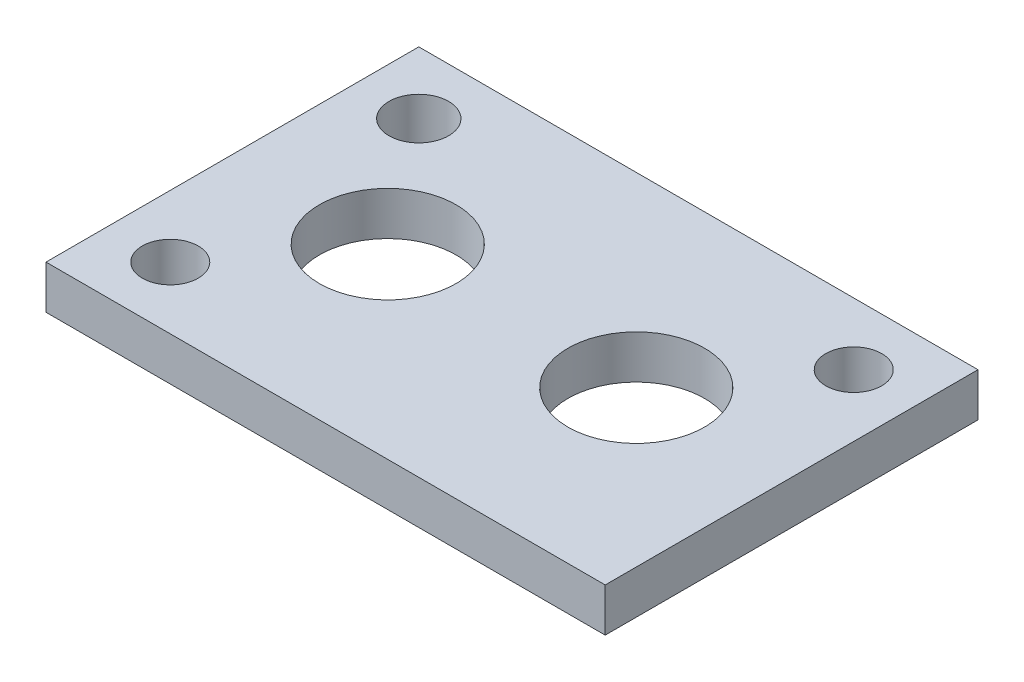
ISO-10303-21;
HEADER;
FILE_DESCRIPTION(('STEP AP214'),'2;1');
FILE_NAME('part.step','',(''),(''),'','','');
FILE_SCHEMA(('AUTOMOTIVE_DESIGN { 1 0 10303 214 1 1 1 1 }'));
ENDSEC;
DATA;
#1=APPLICATION_CONTEXT('core data for automotive mechanical design processes');
#2=APPLICATION_PROTOCOL_DEFINITION('international standard','automotive_design',2000,#1);
#3=PRODUCT_CONTEXT('',#1,'mechanical');
#4=PRODUCT('Part','Part','',(#3));
#5=PRODUCT_RELATED_PRODUCT_CATEGORY('part','',(#4));
#6=PRODUCT_DEFINITION_FORMATION('','',#4);
#7=PRODUCT_DEFINITION_CONTEXT('part definition',#1,'design');
#8=PRODUCT_DEFINITION('design','',#6,#7);
#9=PRODUCT_DEFINITION_SHAPE('','',#8);
#10=(LENGTH_UNIT() NAMED_UNIT(*) SI_UNIT(.MILLI.,.METRE.));
#11=(NAMED_UNIT(*) PLANE_ANGLE_UNIT() SI_UNIT($,.RADIAN.));
#12=(NAMED_UNIT(*) SI_UNIT($,.STERADIAN.) SOLID_ANGLE_UNIT());
#13=UNCERTAINTY_MEASURE_WITH_UNIT(LENGTH_MEASURE(1.E-05),#10,'distance_accuracy_value','');
#14=(GEOMETRIC_REPRESENTATION_CONTEXT(3) GLOBAL_UNCERTAINTY_ASSIGNED_CONTEXT((#13)) GLOBAL_UNIT_ASSIGNED_CONTEXT((#10,
#11,#12)) REPRESENTATION_CONTEXT('',''));
#15=CARTESIAN_POINT('',(0.,0.,0.));
#16=DIRECTION('',(0.,0.,1.));
#17=DIRECTION('',(1.,0.,0.));
#18=AXIS2_PLACEMENT_3D('',#15,#16,#17);
#19=CARTESIAN_POINT('',(0.,7.,0.));
#20=DIRECTION('',(1.,0.,0.));
#21=DIRECTION('',(0.,0.,-1.));
#22=AXIS2_PLACEMENT_3D('',#19,#20,#21);
#23=PLANE('',#22);
#24=DIRECTION('',(0.,0.,1.));
#25=VECTOR('',#24,1.);
#26=CARTESIAN_POINT('',(0.,0.,0.));
#27=LINE('',#26,#25);
#28=CARTESIAN_POINT('',(0.,0.,-60.));
#29=VERTEX_POINT('',#28);
#30=CARTESIAN_POINT('',(0.,0.,0.));
#31=VERTEX_POINT('',#30);
#32=EDGE_CURVE('E96',#29,#31,#27,.T.);
#33=ORIENTED_EDGE('',*,*,#32,.T.);
#34=DIRECTION('',(0.,-1.,0.));
#35=VECTOR('',#34,1.);
#36=CARTESIAN_POINT('',(0.,7.,0.));
#37=LINE('',#36,#35);
#38=CARTESIAN_POINT('',(0.,7.,0.));
#39=VERTEX_POINT('',#38);
#40=EDGE_CURVE('E11',#39,#31,#37,.T.);
#41=ORIENTED_EDGE('',*,*,#40,.F.);
#42=DIRECTION('',(0.,0.,1.));
#43=VECTOR('',#42,1.);
#44=CARTESIAN_POINT('',(0.,7.,0.));
#45=LINE('',#44,#43);
#46=CARTESIAN_POINT('',(0.,7.,-60.));
#47=VERTEX_POINT('',#46);
#48=EDGE_CURVE('E84',#47,#39,#45,.T.);
#49=ORIENTED_EDGE('',*,*,#48,.F.);
#50=DIRECTION('',(0.,-1.,0.));
#51=VECTOR('',#50,1.);
#52=CARTESIAN_POINT('',(0.,7.,-60.));
#53=LINE('',#52,#51);
#54=EDGE_CURVE('E92',#47,#29,#53,.T.);
#55=ORIENTED_EDGE('',*,*,#54,.T.);
#56=EDGE_LOOP('',(#33,#41,#49,#55));
#57=FACE_BOUND('',#56,.T.);
#58=ADVANCED_FACE('F33',(#57),#23,.F.);
#59=CARTESIAN_POINT('',(0.,7.,0.));
#60=DIRECTION('',(0.,0.,-1.));
#61=DIRECTION('',(-1.,0.,0.));
#62=AXIS2_PLACEMENT_3D('',#59,#60,#61);
#63=PLANE('',#62);
#64=DIRECTION('',(1.,0.,0.));
#65=VECTOR('',#64,1.);
#66=CARTESIAN_POINT('',(0.,0.,0.));
#67=LINE('',#66,#65);
#68=CARTESIAN_POINT('',(90.,0.,0.));
#69=VERTEX_POINT('',#68);
#70=EDGE_CURVE('E88',#31,#69,#67,.T.);
#71=ORIENTED_EDGE('',*,*,#70,.T.);
#72=DIRECTION('',(0.,-1.,0.));
#73=VECTOR('',#72,1.);
#74=CARTESIAN_POINT('',(90.,7.,0.));
#75=LINE('',#74,#73);
#76=CARTESIAN_POINT('',(90.,7.,0.));
#77=VERTEX_POINT('',#76);
#78=EDGE_CURVE('E41',#77,#69,#75,.T.);
#79=ORIENTED_EDGE('',*,*,#78,.F.);
#80=DIRECTION('',(1.,0.,0.));
#81=VECTOR('',#80,1.);
#82=CARTESIAN_POINT('',(0.,7.,0.));
#83=LINE('',#82,#81);
#84=EDGE_CURVE('E79',#39,#77,#83,.T.);
#85=ORIENTED_EDGE('',*,*,#84,.F.);
#86=ORIENTED_EDGE('',*,*,#40,.T.);
#87=EDGE_LOOP('',(#71,#79,#85,#86));
#88=FACE_BOUND('',#87,.T.);
#89=ADVANCED_FACE('F87',(#88),#63,.F.);
#90=CARTESIAN_POINT('',(90.,7.,0.));
#91=DIRECTION('',(-1.,0.,0.));
#92=DIRECTION('',(0.,0.,1.));
#93=AXIS2_PLACEMENT_3D('',#90,#91,#92);
#94=PLANE('',#93);
#95=DIRECTION('',(0.,0.,-1.));
#96=VECTOR('',#95,1.);
#97=CARTESIAN_POINT('',(90.,0.,0.));
#98=LINE('',#97,#96);
#99=CARTESIAN_POINT('',(90.,0.,-60.));
#100=VERTEX_POINT('',#99);
#101=EDGE_CURVE('E66',#69,#100,#98,.T.);
#102=ORIENTED_EDGE('',*,*,#101,.T.);
#103=DIRECTION('',(0.,-1.,0.));
#104=VECTOR('',#103,1.);
#105=CARTESIAN_POINT('',(90.,7.,-60.));
#106=LINE('',#105,#104);
#107=CARTESIAN_POINT('',(90.,7.,-60.));
#108=VERTEX_POINT('',#107);
#109=EDGE_CURVE('E89',#108,#100,#106,.T.);
#110=ORIENTED_EDGE('',*,*,#109,.F.);
#111=DIRECTION('',(0.,0.,-1.));
#112=VECTOR('',#111,1.);
#113=CARTESIAN_POINT('',(90.,7.,0.));
#114=LINE('',#113,#112);
#115=EDGE_CURVE('E82',#77,#108,#114,.T.);
#116=ORIENTED_EDGE('',*,*,#115,.F.);
#117=ORIENTED_EDGE('',*,*,#78,.T.);
#118=EDGE_LOOP('',(#102,#110,#116,#117));
#119=FACE_BOUND('',#118,.T.);
#120=ADVANCED_FACE('F90',(#119),#94,.F.);
#121=CARTESIAN_POINT('',(0.,7.,-60.));
#122=DIRECTION('',(0.,0.,1.));
#123=DIRECTION('',(1.,0.,0.));
#124=AXIS2_PLACEMENT_3D('',#121,#122,#123);
#125=PLANE('',#124);
#126=DIRECTION('',(-1.,0.,0.));
#127=VECTOR('',#126,1.);
#128=CARTESIAN_POINT('',(0.,0.,-60.));
#129=LINE('',#128,#127);
#130=EDGE_CURVE('E72',#100,#29,#129,.T.);
#131=ORIENTED_EDGE('',*,*,#130,.T.);
#132=ORIENTED_EDGE('',*,*,#54,.F.);
#133=DIRECTION('',(-1.,0.,0.));
#134=VECTOR('',#133,1.);
#135=CARTESIAN_POINT('',(0.,7.,-60.));
#136=LINE('',#135,#134);
#137=EDGE_CURVE('E49',#108,#47,#136,.T.);
#138=ORIENTED_EDGE('',*,*,#137,.F.);
#139=ORIENTED_EDGE('',*,*,#109,.T.);
#140=EDGE_LOOP('',(#131,#132,#138,#139));
#141=FACE_BOUND('',#140,.T.);
#142=ADVANCED_FACE('F104',(#141),#125,.F.);
#143=CARTESIAN_POINT('',(0.,7.,0.));
#144=DIRECTION('',(0.,-1.,0.));
#145=DIRECTION('',(0.,0.,-1.));
#146=AXIS2_PLACEMENT_3D('',#143,#144,#145);
#147=PLANE('',#146);
#148=CARTESIAN_POINT('',(10.,7.,-50.));
#149=DIRECTION('',(0.,1.,0.));
#150=DIRECTION('',(0.,0.,1.));
#151=AXIS2_PLACEMENT_3D('',#148,#149,#150);
#152=CIRCLE('',#151,4.8);
#153=CARTESIAN_POINT('',(10.,7.,-45.2));
#154=VERTEX_POINT('',#153);
#155=EDGE_CURVE('E134',#154,#154,#152,.T.);
#156=ORIENTED_EDGE('',*,*,#155,.F.);
#157=EDGE_LOOP('',(#156));
#158=FACE_BOUND('',#157,.T.);
#159=CARTESIAN_POINT('',(80.,7.,-50.));
#160=DIRECTION('',(0.,1.,0.));
#161=DIRECTION('',(0.,0.,1.));
#162=AXIS2_PLACEMENT_3D('',#159,#160,#161);
#163=CIRCLE('',#162,4.5);
#164=CARTESIAN_POINT('',(80.,7.,-45.5));
#165=VERTEX_POINT('',#164);
#166=EDGE_CURVE('E130',#165,#165,#163,.T.);
#167=ORIENTED_EDGE('',*,*,#166,.F.);
#168=EDGE_LOOP('',(#167));
#169=FACE_BOUND('',#168,.T.);
#170=CARTESIAN_POINT('',(9.99999999999999,7.,-10.));
#171=DIRECTION('',(0.,1.,0.));
#172=DIRECTION('',(0.,0.,1.));
#173=AXIS2_PLACEMENT_3D('',#170,#171,#172);
#174=CIRCLE('',#173,4.5);
#175=CARTESIAN_POINT('',(9.99999999999999,7.,-5.5));
#176=VERTEX_POINT('',#175);
#177=EDGE_CURVE('E124',#176,#176,#174,.T.);
#178=ORIENTED_EDGE('',*,*,#177,.F.);
#179=EDGE_LOOP('',(#178));
#180=FACE_BOUND('',#179,.T.);
#181=CARTESIAN_POINT('',(25.,7.,-30.));
#182=DIRECTION('',(0.,1.,0.));
#183=DIRECTION('',(0.,0.,1.));
#184=AXIS2_PLACEMENT_3D('',#181,#182,#183);
#185=CIRCLE('',#184,11.);
#186=CARTESIAN_POINT('',(25.,7.,-19.));
#187=VERTEX_POINT('',#186);
#188=EDGE_CURVE('E118',#187,#187,#185,.T.);
#189=ORIENTED_EDGE('',*,*,#188,.F.);
#190=EDGE_LOOP('',(#189));
#191=FACE_BOUND('',#190,.T.);
#192=CARTESIAN_POINT('',(65.,7.,-30.));
#193=DIRECTION('',(0.,1.,0.));
#194=DIRECTION('',(0.,0.,1.));
#195=AXIS2_PLACEMENT_3D('',#192,#193,#194);
#196=CIRCLE('',#195,11.);
#197=CARTESIAN_POINT('',(65.,7.,-19.));
#198=VERTEX_POINT('',#197);
#199=EDGE_CURVE('E112',#198,#198,#196,.T.);
#200=ORIENTED_EDGE('',*,*,#199,.F.);
#201=EDGE_LOOP('',(#200));
#202=FACE_BOUND('',#201,.T.);
#203=ORIENTED_EDGE('',*,*,#48,.T.);
#204=ORIENTED_EDGE('',*,*,#84,.T.);
#205=ORIENTED_EDGE('',*,*,#115,.T.);
#206=ORIENTED_EDGE('',*,*,#137,.T.);
#207=EDGE_LOOP('',(#203,#204,#205,#206));
#208=FACE_BOUND('',#207,.T.);
#209=ADVANCED_FACE('F80',(#158,#169,#180,#191,#202,#208),#147,.F.);
#210=CARTESIAN_POINT('',(0.,0.,0.));
#211=DIRECTION('',(0.,-1.,0.));
#212=DIRECTION('',(0.,0.,-1.));
#213=AXIS2_PLACEMENT_3D('',#210,#211,#212);
#214=PLANE('',#213);
#215=CARTESIAN_POINT('',(10.,0.,-50.));
#216=DIRECTION('',(0.,1.,0.));
#217=DIRECTION('',(0.,0.,1.));
#218=AXIS2_PLACEMENT_3D('',#215,#216,#217);
#219=CIRCLE('',#218,4.8);
#220=CARTESIAN_POINT('',(10.,0.,-45.2));
#221=VERTEX_POINT('',#220);
#222=EDGE_CURVE('E133',#221,#221,#219,.T.);
#223=ORIENTED_EDGE('',*,*,#222,.T.);
#224=EDGE_LOOP('',(#223));
#225=FACE_BOUND('',#224,.T.);
#226=CARTESIAN_POINT('',(80.,0.,-50.));
#227=DIRECTION('',(0.,1.,0.));
#228=DIRECTION('',(0.,0.,1.));
#229=AXIS2_PLACEMENT_3D('',#226,#227,#228);
#230=CIRCLE('',#229,4.5);
#231=CARTESIAN_POINT('',(80.,0.,-45.5));
#232=VERTEX_POINT('',#231);
#233=EDGE_CURVE('E127',#232,#232,#230,.T.);
#234=ORIENTED_EDGE('',*,*,#233,.T.);
#235=EDGE_LOOP('',(#234));
#236=FACE_BOUND('',#235,.T.);
#237=CARTESIAN_POINT('',(9.99999999999999,0.,-10.));
#238=DIRECTION('',(0.,1.,0.));
#239=DIRECTION('',(0.,0.,1.));
#240=AXIS2_PLACEMENT_3D('',#237,#238,#239);
#241=CIRCLE('',#240,4.5);
#242=CARTESIAN_POINT('',(9.99999999999999,0.,-5.5));
#243=VERTEX_POINT('',#242);
#244=EDGE_CURVE('E121',#243,#243,#241,.T.);
#245=ORIENTED_EDGE('',*,*,#244,.T.);
#246=EDGE_LOOP('',(#245));
#247=FACE_BOUND('',#246,.T.);
#248=CARTESIAN_POINT('',(25.,0.,-30.));
#249=DIRECTION('',(0.,1.,0.));
#250=DIRECTION('',(0.,0.,1.));
#251=AXIS2_PLACEMENT_3D('',#248,#249,#250);
#252=CIRCLE('',#251,11.);
#253=CARTESIAN_POINT('',(25.,0.,-19.));
#254=VERTEX_POINT('',#253);
#255=EDGE_CURVE('E115',#254,#254,#252,.T.);
#256=ORIENTED_EDGE('',*,*,#255,.T.);
#257=EDGE_LOOP('',(#256));
#258=FACE_BOUND('',#257,.T.);
#259=CARTESIAN_POINT('',(65.,0.,-30.));
#260=DIRECTION('',(0.,1.,0.));
#261=DIRECTION('',(0.,0.,1.));
#262=AXIS2_PLACEMENT_3D('',#259,#260,#261);
#263=CIRCLE('',#262,11.);
#264=CARTESIAN_POINT('',(65.,0.,-19.));
#265=VERTEX_POINT('',#264);
#266=EDGE_CURVE('E99',#265,#265,#263,.T.);
#267=ORIENTED_EDGE('',*,*,#266,.T.);
#268=EDGE_LOOP('',(#267));
#269=FACE_BOUND('',#268,.T.);
#270=ORIENTED_EDGE('',*,*,#32,.F.);
#271=ORIENTED_EDGE('',*,*,#130,.F.);
#272=ORIENTED_EDGE('',*,*,#101,.F.);
#273=ORIENTED_EDGE('',*,*,#70,.F.);
#274=EDGE_LOOP('',(#270,#271,#272,#273));
#275=FACE_BOUND('',#274,.T.);
#276=ADVANCED_FACE('F107',(#225,#236,#247,#258,#269,#275),#214,.T.);
#277=CARTESIAN_POINT('',(65.,7.,-30.));
#278=DIRECTION('',(0.,1.,0.));
#279=DIRECTION('',(0.,0.,1.));
#280=AXIS2_PLACEMENT_3D('',#277,#278,#279);
#281=CYLINDRICAL_SURFACE('',#280,11.);
#282=ORIENTED_EDGE('',*,*,#266,.F.);
#283=EDGE_LOOP('',(#282));
#284=FACE_BOUND('',#283,.T.);
#285=ORIENTED_EDGE('',*,*,#199,.T.);
#286=EDGE_LOOP('',(#285));
#287=FACE_BOUND('',#286,.T.);
#288=ADVANCED_FACE('F160',(#284,#287),#281,.F.);
#289=CARTESIAN_POINT('',(25.,7.,-30.));
#290=DIRECTION('',(0.,1.,0.));
#291=DIRECTION('',(0.,0.,1.));
#292=AXIS2_PLACEMENT_3D('',#289,#290,#291);
#293=CYLINDRICAL_SURFACE('',#292,11.);
#294=ORIENTED_EDGE('',*,*,#255,.F.);
#295=EDGE_LOOP('',(#294));
#296=FACE_BOUND('',#295,.T.);
#297=ORIENTED_EDGE('',*,*,#188,.T.);
#298=EDGE_LOOP('',(#297));
#299=FACE_BOUND('',#298,.T.);
#300=ADVANCED_FACE('F162',(#296,#299),#293,.F.);
#301=CARTESIAN_POINT('',(9.99999999999999,7.,-10.));
#302=DIRECTION('',(0.,1.,0.));
#303=DIRECTION('',(0.,0.,1.));
#304=AXIS2_PLACEMENT_3D('',#301,#302,#303);
#305=CYLINDRICAL_SURFACE('',#304,4.5);
#306=ORIENTED_EDGE('',*,*,#244,.F.);
#307=EDGE_LOOP('',(#306));
#308=FACE_BOUND('',#307,.T.);
#309=ORIENTED_EDGE('',*,*,#177,.T.);
#310=EDGE_LOOP('',(#309));
#311=FACE_BOUND('',#310,.T.);
#312=ADVANCED_FACE('F169',(#308,#311),#305,.F.);
#313=CARTESIAN_POINT('',(80.,7.,-50.));
#314=DIRECTION('',(0.,1.,0.));
#315=DIRECTION('',(0.,0.,1.));
#316=AXIS2_PLACEMENT_3D('',#313,#314,#315);
#317=CYLINDRICAL_SURFACE('',#316,4.5);
#318=ORIENTED_EDGE('',*,*,#233,.F.);
#319=EDGE_LOOP('',(#318));
#320=FACE_BOUND('',#319,.T.);
#321=ORIENTED_EDGE('',*,*,#166,.T.);
#322=EDGE_LOOP('',(#321));
#323=FACE_BOUND('',#322,.T.);
#324=ADVANCED_FACE('F145',(#320,#323),#317,.F.);
#325=CARTESIAN_POINT('',(10.,0.,-50.));
#326=DIRECTION('',(0.,1.,0.));
#327=DIRECTION('',(0.,0.,1.));
#328=AXIS2_PLACEMENT_3D('',#325,#326,#327);
#329=CYLINDRICAL_SURFACE('',#328,4.8);
#330=ORIENTED_EDGE('',*,*,#222,.F.);
#331=EDGE_LOOP('',(#330));
#332=FACE_BOUND('',#331,.T.);
#333=ORIENTED_EDGE('',*,*,#155,.T.);
#334=EDGE_LOOP('',(#333));
#335=FACE_BOUND('',#334,.T.);
#336=ADVANCED_FACE('F142',(#332,#335),#329,.F.);
#337=CLOSED_SHELL('',(#58,#89,#120,#142,#209,#276,#288,#300,#312,#324,#336));
#338=MANIFOLD_SOLID_BREP('B2',#337);
#339=ADVANCED_BREP_SHAPE_REPRESENTATION('',(#18,#338),#14);
#340=SHAPE_DEFINITION_REPRESENTATION(#9,#339);
ENDSEC;
END-ISO-10303-21;
